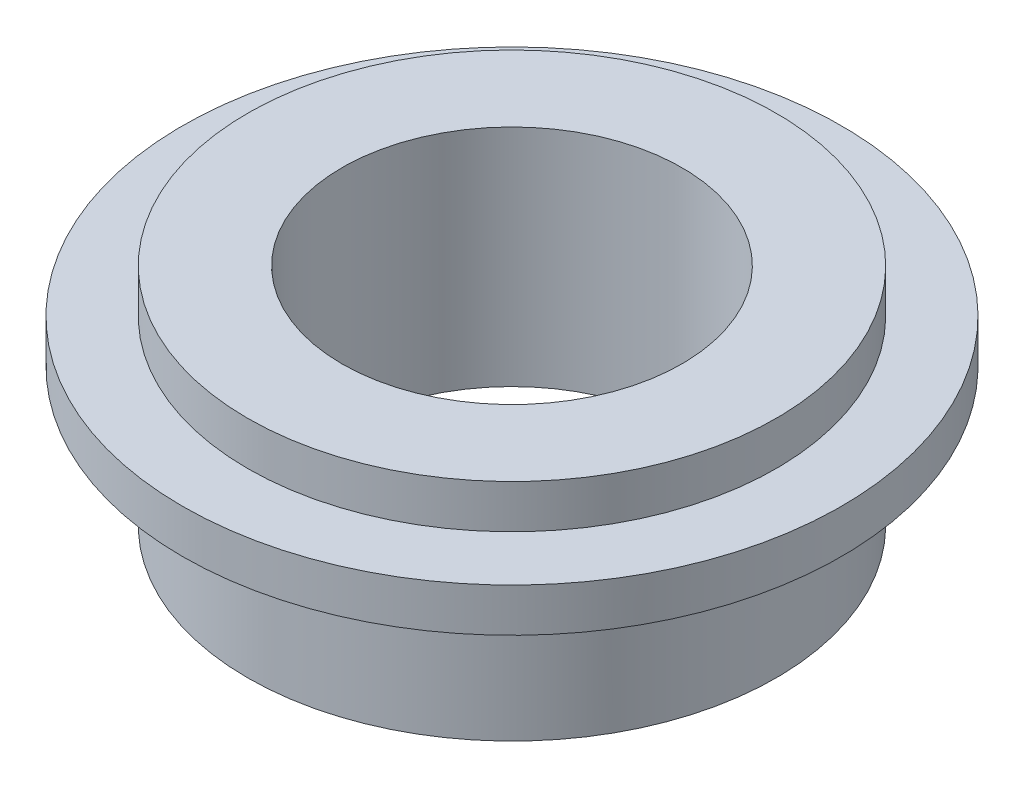
ISO-10303-21;
HEADER;
FILE_DESCRIPTION(('STEP AP214'),'2;1');
FILE_NAME('part.step','',(''),(''),'','','');
FILE_SCHEMA(('AUTOMOTIVE_DESIGN { 1 0 10303 214 1 1 1 1 }'));
ENDSEC;
DATA;
#1=APPLICATION_CONTEXT('core data for automotive mechanical design processes');
#2=APPLICATION_PROTOCOL_DEFINITION('international standard','automotive_design',2000,#1);
#3=PRODUCT_CONTEXT('',#1,'mechanical');
#4=PRODUCT('Part','Part','',(#3));
#5=PRODUCT_RELATED_PRODUCT_CATEGORY('part','',(#4));
#6=PRODUCT_DEFINITION_FORMATION('','',#4);
#7=PRODUCT_DEFINITION_CONTEXT('part definition',#1,'design');
#8=PRODUCT_DEFINITION('design','',#6,#7);
#9=PRODUCT_DEFINITION_SHAPE('','',#8);
#10=(LENGTH_UNIT() NAMED_UNIT(*) SI_UNIT(.MILLI.,.METRE.));
#11=(NAMED_UNIT(*) PLANE_ANGLE_UNIT() SI_UNIT($,.RADIAN.));
#12=(NAMED_UNIT(*) SI_UNIT($,.STERADIAN.) SOLID_ANGLE_UNIT());
#13=UNCERTAINTY_MEASURE_WITH_UNIT(LENGTH_MEASURE(1.E-05),#10,'distance_accuracy_value','');
#14=(GEOMETRIC_REPRESENTATION_CONTEXT(3) GLOBAL_UNCERTAINTY_ASSIGNED_CONTEXT((#13)) GLOBAL_UNIT_ASSIGNED_CONTEXT((#10,
#11,#12)) REPRESENTATION_CONTEXT('',''));
#15=CARTESIAN_POINT('',(0.,0.,0.));
#16=DIRECTION('',(0.,0.,1.));
#17=DIRECTION('',(1.,0.,0.));
#18=AXIS2_PLACEMENT_3D('',#15,#16,#17);
#19=CARTESIAN_POINT('',(0.,11.5440296983532,0.));
#20=DIRECTION('',(0.,1.,0.));
#21=DIRECTION('',(0.,0.,1.));
#22=AXIS2_PLACEMENT_3D('',#19,#20,#21);
#23=CYLINDRICAL_SURFACE('',#22,11.7205259556079);
#24=CARTESIAN_POINT('',(0.,5.55415634797517,0.));
#25=DIRECTION('',(0.,1.,0.));
#26=DIRECTION('',(0.,0.,1.));
#27=AXIS2_PLACEMENT_3D('',#24,#25,#26);
#28=CIRCLE('',#27,11.7205259556079);
#29=CARTESIAN_POINT('',(0.,5.55415634797517,11.7205259556079));
#30=VERTEX_POINT('',#29);
#31=EDGE_CURVE('E37',#30,#30,#28,.T.);
#32=ORIENTED_EDGE('',*,*,#31,.T.);
#33=EDGE_LOOP('',(#32));
#34=FACE_BOUND('',#33,.T.);
#35=CARTESIAN_POINT('',(0.,-9.94584365202483,0.));
#36=DIRECTION('',(0.,1.,0.));
#37=DIRECTION('',(0.,0.,1.));
#38=AXIS2_PLACEMENT_3D('',#35,#36,#37);
#39=CIRCLE('',#38,11.7205259556079);
#40=CARTESIAN_POINT('',(0.,-9.94584365202483,11.7205259556079));
#41=VERTEX_POINT('',#40);
#42=EDGE_CURVE('E56',#41,#41,#39,.T.);
#43=ORIENTED_EDGE('',*,*,#42,.F.);
#44=EDGE_LOOP('',(#43));
#45=FACE_BOUND('',#44,.T.);
#46=ADVANCED_FACE('F31',(#34,#45),#23,.F.);
#47=CARTESIAN_POINT('',(-11.7205259556079,5.55415634797517,0.));
#48=DIRECTION('',(0.,1.,0.));
#49=DIRECTION('',(0.,0.,1.));
#50=AXIS2_PLACEMENT_3D('',#47,#48,#49);
#51=PLANE('',#50);
#52=CARTESIAN_POINT('',(0.,5.55415634797517,0.));
#53=DIRECTION('',(0.,1.,0.));
#54=DIRECTION('',(0.,0.,1.));
#55=AXIS2_PLACEMENT_3D('',#52,#53,#54);
#56=CIRCLE('',#55,18.2205259556079);
#57=CARTESIAN_POINT('',(0.,5.55415634797517,18.2205259556079));
#58=VERTEX_POINT('',#57);
#59=EDGE_CURVE('E41',#58,#58,#56,.T.);
#60=ORIENTED_EDGE('',*,*,#59,.T.);
#61=EDGE_LOOP('',(#60));
#62=FACE_BOUND('',#61,.T.);
#63=ORIENTED_EDGE('',*,*,#31,.F.);
#64=EDGE_LOOP('',(#63));
#65=FACE_BOUND('',#64,.T.);
#66=ADVANCED_FACE('F83',(#62,#65),#51,.T.);
#67=CARTESIAN_POINT('',(0.,11.5440296983532,0.));
#68=DIRECTION('',(0.,1.,0.));
#69=DIRECTION('',(0.,0.,1.));
#70=AXIS2_PLACEMENT_3D('',#67,#68,#69);
#71=CYLINDRICAL_SURFACE('',#70,18.2205259556079);
#72=CARTESIAN_POINT('',(0.,2.55415634797517,0.));
#73=DIRECTION('',(0.,1.,0.));
#74=DIRECTION('',(0.,0.,1.));
#75=AXIS2_PLACEMENT_3D('',#72,#73,#74);
#76=CIRCLE('',#75,18.2205259556079);
#77=CARTESIAN_POINT('',(0.,2.55415634797517,18.2205259556079));
#78=VERTEX_POINT('',#77);
#79=EDGE_CURVE('E45',#78,#78,#76,.T.);
#80=ORIENTED_EDGE('',*,*,#79,.T.);
#81=EDGE_LOOP('',(#80));
#82=FACE_BOUND('',#81,.T.);
#83=ORIENTED_EDGE('',*,*,#59,.F.);
#84=EDGE_LOOP('',(#83));
#85=FACE_BOUND('',#84,.T.);
#86=ADVANCED_FACE('F78',(#82,#85),#71,.T.);
#87=CARTESIAN_POINT('',(-18.2205259556079,2.55415634797517,0.));
#88=DIRECTION('',(0.,1.,0.));
#89=DIRECTION('',(0.,0.,1.));
#90=AXIS2_PLACEMENT_3D('',#87,#88,#89);
#91=PLANE('',#90);
#92=CARTESIAN_POINT('',(0.,2.55415634797517,0.));
#93=DIRECTION('',(0.,1.,0.));
#94=DIRECTION('',(0.,0.,1.));
#95=AXIS2_PLACEMENT_3D('',#92,#93,#94);
#96=CIRCLE('',#95,22.7205259556079);
#97=CARTESIAN_POINT('',(0.,2.55415634797517,22.7205259556079));
#98=VERTEX_POINT('',#97);
#99=EDGE_CURVE('E50',#98,#98,#96,.T.);
#100=ORIENTED_EDGE('',*,*,#99,.T.);
#101=EDGE_LOOP('',(#100));
#102=FACE_BOUND('',#101,.T.);
#103=ORIENTED_EDGE('',*,*,#79,.F.);
#104=EDGE_LOOP('',(#103));
#105=FACE_BOUND('',#104,.T.);
#106=ADVANCED_FACE('F68',(#102,#105),#91,.T.);
#107=CARTESIAN_POINT('',(0.,11.5440296983532,0.));
#108=DIRECTION('',(0.,1.,0.));
#109=DIRECTION('',(0.,0.,1.));
#110=AXIS2_PLACEMENT_3D('',#107,#108,#109);
#111=CYLINDRICAL_SURFACE('',#110,22.7205259556079);
#112=ORIENTED_EDGE('',*,*,#99,.F.);
#113=EDGE_LOOP('',(#112));
#114=FACE_BOUND('',#113,.T.);
#115=CARTESIAN_POINT('',(0.,-0.44584365202483,0.));
#116=DIRECTION('',(0.,-1.,0.));
#117=DIRECTION('',(0.,0.,-1.));
#118=AXIS2_PLACEMENT_3D('',#115,#116,#117);
#119=CIRCLE('',#118,22.7205259556079);
#120=CARTESIAN_POINT('',(0.,-0.44584365202483,-22.7205259556079));
#121=VERTEX_POINT('',#120);
#122=EDGE_CURVE('E59',#121,#121,#119,.T.);
#123=ORIENTED_EDGE('',*,*,#122,.F.);
#124=EDGE_LOOP('',(#123));
#125=FACE_BOUND('',#124,.T.);
#126=ADVANCED_FACE('F65',(#114,#125),#111,.T.);
#127=CARTESIAN_POINT('',(0.,11.5440296983532,0.));
#128=DIRECTION('',(0.,1.,0.));
#129=DIRECTION('',(0.,0.,1.));
#130=AXIS2_PLACEMENT_3D('',#127,#128,#129);
#131=CYLINDRICAL_SURFACE('',#130,18.2205259556079);
#132=CARTESIAN_POINT('',(0.,-0.44584365202483,0.));
#133=DIRECTION('',(0.,-1.,0.));
#134=DIRECTION('',(0.,0.,-1.));
#135=AXIS2_PLACEMENT_3D('',#132,#133,#134);
#136=CIRCLE('',#135,18.2205259556079);
#137=CARTESIAN_POINT('',(0.,-0.44584365202483,-18.2205259556079));
#138=VERTEX_POINT('',#137);
#139=EDGE_CURVE('E10',#138,#138,#136,.F.);
#140=ORIENTED_EDGE('',*,*,#139,.F.);
#141=EDGE_LOOP('',(#140));
#142=FACE_BOUND('',#141,.T.);
#143=CARTESIAN_POINT('',(0.,-9.94584365202483,0.));
#144=DIRECTION('',(0.,1.,0.));
#145=DIRECTION('',(0.,0.,1.));
#146=AXIS2_PLACEMENT_3D('',#143,#144,#145);
#147=CIRCLE('',#146,18.2205259556079);
#148=CARTESIAN_POINT('',(0.,-9.94584365202483,18.2205259556079));
#149=VERTEX_POINT('',#148);
#150=EDGE_CURVE('E53',#149,#149,#147,.T.);
#151=ORIENTED_EDGE('',*,*,#150,.T.);
#152=EDGE_LOOP('',(#151));
#153=FACE_BOUND('',#152,.T.);
#154=ADVANCED_FACE('F67',(#142,#153),#131,.T.);
#155=CARTESIAN_POINT('',(-18.2205259556079,-9.94584365202483,0.));
#156=DIRECTION('',(0.,-1.,0.));
#157=DIRECTION('',(0.,0.,-1.));
#158=AXIS2_PLACEMENT_3D('',#155,#156,#157);
#159=PLANE('',#158);
#160=ORIENTED_EDGE('',*,*,#42,.T.);
#161=EDGE_LOOP('',(#160));
#162=FACE_BOUND('',#161,.T.);
#163=ORIENTED_EDGE('',*,*,#150,.F.);
#164=EDGE_LOOP('',(#163));
#165=FACE_BOUND('',#164,.T.);
#166=ADVANCED_FACE('F75',(#162,#165),#159,.T.);
#167=CARTESIAN_POINT('',(0.,-0.44584365202483,0.));
#168=DIRECTION('',(0.,-1.,0.));
#169=DIRECTION('',(0.,0.,-1.));
#170=AXIS2_PLACEMENT_3D('',#167,#168,#169);
#171=PLANE('',#170);
#172=ORIENTED_EDGE('',*,*,#122,.T.);
#173=EDGE_LOOP('',(#172));
#174=FACE_BOUND('',#173,.T.);
#175=ORIENTED_EDGE('',*,*,#139,.T.);
#176=EDGE_LOOP('',(#175));
#177=FACE_BOUND('',#176,.T.);
#178=ADVANCED_FACE('F63',(#174,#177),#171,.T.);
#179=CLOSED_SHELL('',(#46,#66,#86,#106,#126,#154,#166,#178));
#180=MANIFOLD_SOLID_BREP('B2',#179);
#181=ADVANCED_BREP_SHAPE_REPRESENTATION('',(#18,#180),#14);
#182=SHAPE_DEFINITION_REPRESENTATION(#9,#181);
ENDSEC;
END-ISO-10303-21;
